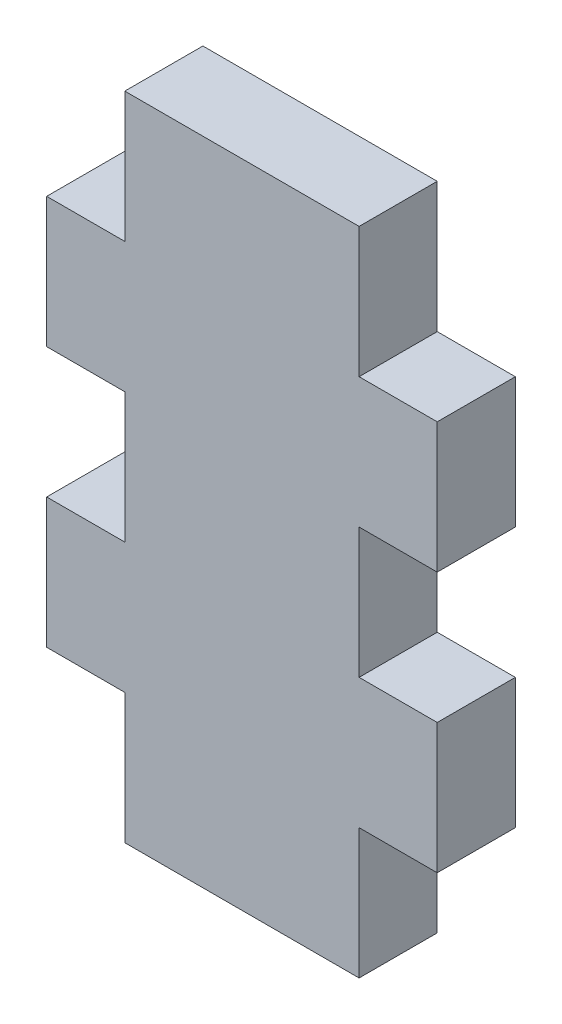
ISO-10303-21;
HEADER;
FILE_DESCRIPTION(('STEP AP214'),'2;1');
FILE_NAME('part.step','',(''),(''),'','','');
FILE_SCHEMA(('AUTOMOTIVE_DESIGN { 1 0 10303 214 1 1 1 1 }'));
ENDSEC;
DATA;
#1=APPLICATION_CONTEXT('core data for automotive mechanical design processes');
#2=APPLICATION_PROTOCOL_DEFINITION('international standard','automotive_design',2000,#1);
#3=PRODUCT_CONTEXT('',#1,'mechanical');
#4=PRODUCT('Part','Part','',(#3));
#5=PRODUCT_RELATED_PRODUCT_CATEGORY('part','',(#4));
#6=PRODUCT_DEFINITION_FORMATION('','',#4);
#7=PRODUCT_DEFINITION_CONTEXT('part definition',#1,'design');
#8=PRODUCT_DEFINITION('design','',#6,#7);
#9=PRODUCT_DEFINITION_SHAPE('','',#8);
#10=(LENGTH_UNIT() NAMED_UNIT(*) SI_UNIT(.MILLI.,.METRE.));
#11=(NAMED_UNIT(*) PLANE_ANGLE_UNIT() SI_UNIT($,.RADIAN.));
#12=(NAMED_UNIT(*) SI_UNIT($,.STERADIAN.) SOLID_ANGLE_UNIT());
#13=UNCERTAINTY_MEASURE_WITH_UNIT(LENGTH_MEASURE(1.E-05),#10,'distance_accuracy_value','');
#14=(GEOMETRIC_REPRESENTATION_CONTEXT(3) GLOBAL_UNCERTAINTY_ASSIGNED_CONTEXT((#13)) GLOBAL_UNIT_ASSIGNED_CONTEXT((#10,
#11,#12)) REPRESENTATION_CONTEXT('',''));
#15=CARTESIAN_POINT('',(0.,0.,0.));
#16=DIRECTION('',(0.,0.,1.));
#17=DIRECTION('',(1.,0.,0.));
#18=AXIS2_PLACEMENT_3D('',#15,#16,#17);
#19=CARTESIAN_POINT('',(0.,0.,15.24));
#20=DIRECTION('',(-1.,0.,0.));
#21=DIRECTION('',(0.,-1.,0.));
#22=AXIS2_PLACEMENT_3D('',#19,#20,#21);
#23=PLANE('',#22);
#24=DIRECTION('',(0.,0.,1.));
#25=VECTOR('',#24,1.);
#26=CARTESIAN_POINT('',(0.,76.2,0.));
#27=LINE('',#26,#25);
#28=CARTESIAN_POINT('',(0.,76.2,0.));
#29=VERTEX_POINT('',#28);
#30=CARTESIAN_POINT('',(0.,76.2,15.24));
#31=VERTEX_POINT('',#30);
#32=EDGE_CURVE('E233',#29,#31,#27,.T.);
#33=ORIENTED_EDGE('',*,*,#32,.T.);
#34=DIRECTION('',(0.,1.,0.));
#35=VECTOR('',#34,1.);
#36=CARTESIAN_POINT('',(0.,0.,15.24));
#37=LINE('',#36,#35);
#38=CARTESIAN_POINT('',(0.,101.6,15.24));
#39=VERTEX_POINT('',#38);
#40=EDGE_CURVE('E42',#31,#39,#37,.T.);
#41=ORIENTED_EDGE('',*,*,#40,.T.);
#42=DIRECTION('',(0.,0.,1.));
#43=VECTOR('',#42,1.);
#44=CARTESIAN_POINT('',(0.,101.6,0.));
#45=LINE('',#44,#43);
#46=CARTESIAN_POINT('',(0.,101.6,0.));
#47=VERTEX_POINT('',#46);
#48=EDGE_CURVE('E220',#47,#39,#45,.T.);
#49=ORIENTED_EDGE('',*,*,#48,.F.);
#50=DIRECTION('',(0.,1.,0.));
#51=VECTOR('',#50,1.);
#52=CARTESIAN_POINT('',(0.,0.,0.));
#53=LINE('',#52,#51);
#54=EDGE_CURVE('E37',#29,#47,#53,.T.);
#55=ORIENTED_EDGE('',*,*,#54,.F.);
#56=EDGE_LOOP('',(#33,#41,#49,#55));
#57=FACE_BOUND('',#56,.T.);
#58=ADVANCED_FACE('F33',(#57),#23,.T.);
#59=CARTESIAN_POINT('',(76.2,0.,15.24));
#60=DIRECTION('',(-1.,0.,0.));
#61=DIRECTION('',(0.,-1.,0.));
#62=AXIS2_PLACEMENT_3D('',#59,#60,#61);
#63=PLANE('',#62);
#64=DIRECTION('',(0.,1.,0.));
#65=VECTOR('',#64,1.);
#66=CARTESIAN_POINT('',(76.2,0.,0.));
#67=LINE('',#66,#65);
#68=CARTESIAN_POINT('',(76.2,25.4,0.));
#69=VERTEX_POINT('',#68);
#70=CARTESIAN_POINT('',(76.2,50.8,0.));
#71=VERTEX_POINT('',#70);
#72=EDGE_CURVE('E190',#69,#71,#67,.T.);
#73=ORIENTED_EDGE('',*,*,#72,.T.);
#74=DIRECTION('',(0.,0.,1.));
#75=VECTOR('',#74,1.);
#76=CARTESIAN_POINT('',(76.2,50.8,0.));
#77=LINE('',#76,#75);
#78=CARTESIAN_POINT('',(76.2,50.8,15.24));
#79=VERTEX_POINT('',#78);
#80=EDGE_CURVE('E244',#71,#79,#77,.T.);
#81=ORIENTED_EDGE('',*,*,#80,.T.);
#82=DIRECTION('',(0.,1.,0.));
#83=VECTOR('',#82,1.);
#84=CARTESIAN_POINT('',(76.2,0.,15.24));
#85=LINE('',#84,#83);
#86=CARTESIAN_POINT('',(76.2,25.4,15.24));
#87=VERTEX_POINT('',#86);
#88=EDGE_CURVE('E192',#87,#79,#85,.T.);
#89=ORIENTED_EDGE('',*,*,#88,.F.);
#90=DIRECTION('',(0.,0.,1.));
#91=VECTOR('',#90,1.);
#92=CARTESIAN_POINT('',(76.2,25.4,0.));
#93=LINE('',#92,#91);
#94=EDGE_CURVE('E176',#69,#87,#93,.T.);
#95=ORIENTED_EDGE('',*,*,#94,.F.);
#96=EDGE_LOOP('',(#73,#81,#89,#95));
#97=FACE_BOUND('',#96,.T.);
#98=ADVANCED_FACE('F188',(#97),#63,.F.);
#99=CARTESIAN_POINT('',(0.,127.,15.24));
#100=DIRECTION('',(0.,1.,0.));
#101=DIRECTION('',(0.,0.,1.));
#102=AXIS2_PLACEMENT_3D('',#99,#100,#101);
#103=PLANE('',#102);
#104=DIRECTION('',(0.,0.,1.));
#105=VECTOR('',#104,1.);
#106=CARTESIAN_POINT('',(60.96,127.,0.));
#107=LINE('',#106,#105);
#108=CARTESIAN_POINT('',(60.96,127.,0.));
#109=VERTEX_POINT('',#108);
#110=CARTESIAN_POINT('',(60.96,127.,15.24));
#111=VERTEX_POINT('',#110);
#112=EDGE_CURVE('E262',#109,#111,#107,.T.);
#113=ORIENTED_EDGE('',*,*,#112,.F.);
#114=DIRECTION('',(1.,0.,0.));
#115=VECTOR('',#114,1.);
#116=CARTESIAN_POINT('',(0.,127.,0.));
#117=LINE('',#116,#115);
#118=CARTESIAN_POINT('',(15.24,127.,0.));
#119=VERTEX_POINT('',#118);
#120=EDGE_CURVE('E204',#119,#109,#117,.T.);
#121=ORIENTED_EDGE('',*,*,#120,.F.);
#122=DIRECTION('',(0.,0.,1.));
#123=VECTOR('',#122,1.);
#124=CARTESIAN_POINT('',(15.24,127.,0.));
#125=LINE('',#124,#123);
#126=CARTESIAN_POINT('',(15.24,127.,15.24));
#127=VERTEX_POINT('',#126);
#128=EDGE_CURVE('E207',#119,#127,#125,.T.);
#129=ORIENTED_EDGE('',*,*,#128,.T.);
#130=DIRECTION('',(1.,0.,0.));
#131=VECTOR('',#130,1.);
#132=CARTESIAN_POINT('',(0.,127.,15.24));
#133=LINE('',#132,#131);
#134=EDGE_CURVE('E216',#127,#111,#133,.T.);
#135=ORIENTED_EDGE('',*,*,#134,.T.);
#136=EDGE_LOOP('',(#113,#121,#129,#135));
#137=FACE_BOUND('',#136,.T.);
#138=ADVANCED_FACE('F35',(#137),#103,.T.);
#139=DIRECTION('',(0.,0.,1.));
#140=VECTOR('',#139,1.);
#141=CARTESIAN_POINT('',(0.,50.8,0.));
#142=LINE('',#141,#140);
#143=CARTESIAN_POINT('',(0.,50.8,0.));
#144=VERTEX_POINT('',#143);
#145=CARTESIAN_POINT('',(0.,50.8,15.24));
#146=VERTEX_POINT('',#145);
#147=EDGE_CURVE('E296',#144,#146,#142,.T.);
#148=ORIENTED_EDGE('',*,*,#147,.F.);
#149=CARTESIAN_POINT('',(0.,25.4,0.));
#150=VERTEX_POINT('',#149);
#151=EDGE_CURVE('E219',#150,#144,#53,.T.);
#152=ORIENTED_EDGE('',*,*,#151,.F.);
#153=DIRECTION('',(0.,0.,1.));
#154=VECTOR('',#153,1.);
#155=CARTESIAN_POINT('',(0.,25.4,0.));
#156=LINE('',#155,#154);
#157=CARTESIAN_POINT('',(0.,25.4,15.24));
#158=VERTEX_POINT('',#157);
#159=EDGE_CURVE('E284',#150,#158,#156,.T.);
#160=ORIENTED_EDGE('',*,*,#159,.T.);
#161=EDGE_CURVE('E11',#158,#146,#37,.T.);
#162=ORIENTED_EDGE('',*,*,#161,.T.);
#163=EDGE_LOOP('',(#148,#152,#160,#162));
#164=FACE_BOUND('',#163,.T.);
#165=ADVANCED_FACE('F344',(#164),#23,.T.);
#166=CARTESIAN_POINT('',(0.,0.,15.24));
#167=DIRECTION('',(0.,1.,0.));
#168=DIRECTION('',(0.,0.,1.));
#169=AXIS2_PLACEMENT_3D('',#166,#167,#168);
#170=PLANE('',#169);
#171=DIRECTION('',(1.,0.,0.));
#172=VECTOR('',#171,1.);
#173=CARTESIAN_POINT('',(0.,0.,15.24));
#174=LINE('',#173,#172);
#175=CARTESIAN_POINT('',(15.24,0.,15.24));
#176=VERTEX_POINT('',#175);
#177=CARTESIAN_POINT('',(60.96,0.,15.24));
#178=VERTEX_POINT('',#177);
#179=EDGE_CURVE('E210',#176,#178,#174,.T.);
#180=ORIENTED_EDGE('',*,*,#179,.F.);
#181=DIRECTION('',(0.,0.,1.));
#182=VECTOR('',#181,1.);
#183=CARTESIAN_POINT('',(15.24,0.,0.));
#184=LINE('',#183,#182);
#185=CARTESIAN_POINT('',(15.24,0.,0.));
#186=VERTEX_POINT('',#185);
#187=EDGE_CURVE('E280',#186,#176,#184,.T.);
#188=ORIENTED_EDGE('',*,*,#187,.F.);
#189=DIRECTION('',(1.,0.,0.));
#190=VECTOR('',#189,1.);
#191=CARTESIAN_POINT('',(0.,0.,0.));
#192=LINE('',#191,#190);
#193=CARTESIAN_POINT('',(60.96,0.,0.));
#194=VERTEX_POINT('',#193);
#195=EDGE_CURVE('E199',#186,#194,#192,.T.);
#196=ORIENTED_EDGE('',*,*,#195,.T.);
#197=DIRECTION('',(0.,0.,1.));
#198=VECTOR('',#197,1.);
#199=CARTESIAN_POINT('',(60.96,0.,0.));
#200=LINE('',#199,#198);
#201=EDGE_CURVE('E256',#194,#178,#200,.T.);
#202=ORIENTED_EDGE('',*,*,#201,.T.);
#203=EDGE_LOOP('',(#180,#188,#196,#202));
#204=FACE_BOUND('',#203,.T.);
#205=ADVANCED_FACE('F329',(#204),#170,.F.);
#206=CARTESIAN_POINT('',(76.2,76.2,0.));
#207=VERTEX_POINT('',#206);
#208=CARTESIAN_POINT('',(76.2,101.6,0.));
#209=VERTEX_POINT('',#208);
#210=EDGE_CURVE('E200',#207,#209,#67,.T.);
#211=ORIENTED_EDGE('',*,*,#210,.T.);
#212=DIRECTION('',(0.,0.,1.));
#213=VECTOR('',#212,1.);
#214=CARTESIAN_POINT('',(76.2,101.6,0.));
#215=LINE('',#214,#213);
#216=CARTESIAN_POINT('',(76.2,101.6,15.24));
#217=VERTEX_POINT('',#216);
#218=EDGE_CURVE('E267',#209,#217,#215,.T.);
#219=ORIENTED_EDGE('',*,*,#218,.T.);
#220=CARTESIAN_POINT('',(76.2,76.2,15.24));
#221=VERTEX_POINT('',#220);
#222=EDGE_CURVE('E213',#221,#217,#85,.T.);
#223=ORIENTED_EDGE('',*,*,#222,.F.);
#224=DIRECTION('',(0.,0.,1.));
#225=VECTOR('',#224,1.);
#226=CARTESIAN_POINT('',(76.2,76.2,0.));
#227=LINE('',#226,#225);
#228=EDGE_CURVE('E238',#207,#221,#227,.T.);
#229=ORIENTED_EDGE('',*,*,#228,.F.);
#230=EDGE_LOOP('',(#211,#219,#223,#229));
#231=FACE_BOUND('',#230,.T.);
#232=ADVANCED_FACE('F373',(#231),#63,.F.);
#233=CARTESIAN_POINT('',(0.,0.,15.24));
#234=DIRECTION('',(0.,0.,1.));
#235=DIRECTION('',(1.,0.,0.));
#236=AXIS2_PLACEMENT_3D('',#233,#234,#235);
#237=PLANE('',#236);
#238=DIRECTION('',(-1.,0.,0.));
#239=VECTOR('',#238,1.);
#240=CARTESIAN_POINT('',(0.,76.2,15.24));
#241=LINE('',#240,#239);
#242=CARTESIAN_POINT('',(15.24,76.2,15.24));
#243=VERTEX_POINT('',#242);
#244=EDGE_CURVE('E305',#243,#31,#241,.T.);
#245=ORIENTED_EDGE('',*,*,#244,.F.);
#246=DIRECTION('',(0.,1.,0.));
#247=VECTOR('',#246,1.);
#248=CARTESIAN_POINT('',(15.24,76.2,15.24));
#249=LINE('',#248,#247);
#250=CARTESIAN_POINT('',(15.24,50.8,15.24));
#251=VERTEX_POINT('',#250);
#252=EDGE_CURVE('E308',#251,#243,#249,.T.);
#253=ORIENTED_EDGE('',*,*,#252,.F.);
#254=DIRECTION('',(1.,0.,0.));
#255=VECTOR('',#254,1.);
#256=CARTESIAN_POINT('',(0.,50.8,15.24));
#257=LINE('',#256,#255);
#258=EDGE_CURVE('E287',#146,#251,#257,.T.);
#259=ORIENTED_EDGE('',*,*,#258,.F.);
#260=ORIENTED_EDGE('',*,*,#161,.F.);
#261=DIRECTION('',(-1.,0.,0.));
#262=VECTOR('',#261,1.);
#263=CARTESIAN_POINT('',(0.,25.4,15.24));
#264=LINE('',#263,#262);
#265=CARTESIAN_POINT('',(15.24,25.4,15.24));
#266=VERTEX_POINT('',#265);
#267=EDGE_CURVE('E288',#266,#158,#264,.T.);
#268=ORIENTED_EDGE('',*,*,#267,.F.);
#269=DIRECTION('',(0.,1.,0.));
#270=VECTOR('',#269,1.);
#271=CARTESIAN_POINT('',(15.24,0.,15.24));
#272=LINE('',#271,#270);
#273=EDGE_CURVE('E270',#176,#266,#272,.T.);
#274=ORIENTED_EDGE('',*,*,#273,.F.);
#275=ORIENTED_EDGE('',*,*,#179,.T.);
#276=DIRECTION('',(0.,-1.,0.));
#277=VECTOR('',#276,1.);
#278=CARTESIAN_POINT('',(60.96,25.4,15.24));
#279=LINE('',#278,#277);
#280=CARTESIAN_POINT('',(60.96,25.4,15.24));
#281=VERTEX_POINT('',#280);
#282=EDGE_CURVE('E183',#281,#178,#279,.T.);
#283=ORIENTED_EDGE('',*,*,#282,.F.);
#284=DIRECTION('',(-1.,0.,0.));
#285=VECTOR('',#284,1.);
#286=CARTESIAN_POINT('',(76.2,25.4,15.24));
#287=LINE('',#286,#285);
#288=EDGE_CURVE('E322',#87,#281,#287,.T.);
#289=ORIENTED_EDGE('',*,*,#288,.F.);
#290=ORIENTED_EDGE('',*,*,#88,.T.);
#291=DIRECTION('',(1.,0.,0.));
#292=VECTOR('',#291,1.);
#293=CARTESIAN_POINT('',(76.2,50.8,15.24));
#294=LINE('',#293,#292);
#295=CARTESIAN_POINT('',(60.96,50.8,15.24));
#296=VERTEX_POINT('',#295);
#297=EDGE_CURVE('E247',#296,#79,#294,.T.);
#298=ORIENTED_EDGE('',*,*,#297,.F.);
#299=DIRECTION('',(0.,-1.,0.));
#300=VECTOR('',#299,1.);
#301=CARTESIAN_POINT('',(60.96,76.2,15.24));
#302=LINE('',#301,#300);
#303=CARTESIAN_POINT('',(60.96,76.2,15.24));
#304=VERTEX_POINT('',#303);
#305=EDGE_CURVE('E250',#304,#296,#302,.T.);
#306=ORIENTED_EDGE('',*,*,#305,.F.);
#307=DIRECTION('',(-1.,0.,0.));
#308=VECTOR('',#307,1.);
#309=CARTESIAN_POINT('',(76.2,76.2,15.24));
#310=LINE('',#309,#308);
#311=EDGE_CURVE('E253',#221,#304,#310,.T.);
#312=ORIENTED_EDGE('',*,*,#311,.F.);
#313=ORIENTED_EDGE('',*,*,#222,.T.);
#314=DIRECTION('',(1.,0.,0.));
#315=VECTOR('',#314,1.);
#316=CARTESIAN_POINT('',(76.2,101.6,15.24));
#317=LINE('',#316,#315);
#318=CARTESIAN_POINT('',(60.96,101.6,15.24));
#319=VERTEX_POINT('',#318);
#320=EDGE_CURVE('E271',#319,#217,#317,.T.);
#321=ORIENTED_EDGE('',*,*,#320,.F.);
#322=DIRECTION('',(0.,-1.,0.));
#323=VECTOR('',#322,1.);
#324=CARTESIAN_POINT('',(60.96,127.,15.24));
#325=LINE('',#324,#323);
#326=EDGE_CURVE('E246',#111,#319,#325,.T.);
#327=ORIENTED_EDGE('',*,*,#326,.F.);
#328=ORIENTED_EDGE('',*,*,#134,.F.);
#329=DIRECTION('',(0.,1.,0.));
#330=VECTOR('',#329,1.);
#331=CARTESIAN_POINT('',(15.24,127.,15.24));
#332=LINE('',#331,#330);
#333=CARTESIAN_POINT('',(15.24,101.6,15.24));
#334=VERTEX_POINT('',#333);
#335=EDGE_CURVE('E227',#334,#127,#332,.T.);
#336=ORIENTED_EDGE('',*,*,#335,.F.);
#337=DIRECTION('',(1.,0.,0.));
#338=VECTOR('',#337,1.);
#339=CARTESIAN_POINT('',(0.,101.6,15.24));
#340=LINE('',#339,#338);
#341=EDGE_CURVE('E230',#39,#334,#340,.T.);
#342=ORIENTED_EDGE('',*,*,#341,.F.);
#343=ORIENTED_EDGE('',*,*,#40,.F.);
#344=EDGE_LOOP('',(#245,#253,#259,#260,#268,#274,#275,#283,#289,#290,#298,#306,#312,#313,#321,
#327,#328,#336,#342,#343));
#345=FACE_BOUND('',#344,.T.);
#346=ADVANCED_FACE('F336',(#345),#237,.T.);
#347=CARTESIAN_POINT('',(0.,0.,0.));
#348=DIRECTION('',(0.,0.,1.));
#349=DIRECTION('',(1.,0.,0.));
#350=AXIS2_PLACEMENT_3D('',#347,#348,#349);
#351=PLANE('',#350);
#352=DIRECTION('',(0.,1.,0.));
#353=VECTOR('',#352,1.);
#354=CARTESIAN_POINT('',(15.24,76.2,0.));
#355=LINE('',#354,#353);
#356=CARTESIAN_POINT('',(15.24,50.8,0.));
#357=VERTEX_POINT('',#356);
#358=CARTESIAN_POINT('',(15.24,76.2,0.));
#359=VERTEX_POINT('',#358);
#360=EDGE_CURVE('E50',#357,#359,#355,.T.);
#361=ORIENTED_EDGE('',*,*,#360,.T.);
#362=DIRECTION('',(-1.,0.,0.));
#363=VECTOR('',#362,1.);
#364=CARTESIAN_POINT('',(0.,76.2,0.));
#365=LINE('',#364,#363);
#366=EDGE_CURVE('E299',#359,#29,#365,.T.);
#367=ORIENTED_EDGE('',*,*,#366,.T.);
#368=ORIENTED_EDGE('',*,*,#54,.T.);
#369=DIRECTION('',(1.,0.,0.));
#370=VECTOR('',#369,1.);
#371=CARTESIAN_POINT('',(0.,101.6,0.));
#372=LINE('',#371,#370);
#373=CARTESIAN_POINT('',(15.24,101.6,0.));
#374=VERTEX_POINT('',#373);
#375=EDGE_CURVE('E229',#47,#374,#372,.T.);
#376=ORIENTED_EDGE('',*,*,#375,.T.);
#377=DIRECTION('',(0.,1.,0.));
#378=VECTOR('',#377,1.);
#379=CARTESIAN_POINT('',(15.24,127.,0.));
#380=LINE('',#379,#378);
#381=EDGE_CURVE('E223',#374,#119,#380,.T.);
#382=ORIENTED_EDGE('',*,*,#381,.T.);
#383=ORIENTED_EDGE('',*,*,#120,.T.);
#384=DIRECTION('',(0.,-1.,0.));
#385=VECTOR('',#384,1.);
#386=CARTESIAN_POINT('',(60.96,127.,0.));
#387=LINE('',#386,#385);
#388=CARTESIAN_POINT('',(60.96,101.6,0.));
#389=VERTEX_POINT('',#388);
#390=EDGE_CURVE('E273',#109,#389,#387,.T.);
#391=ORIENTED_EDGE('',*,*,#390,.T.);
#392=DIRECTION('',(1.,0.,0.));
#393=VECTOR('',#392,1.);
#394=CARTESIAN_POINT('',(76.2,101.6,0.));
#395=LINE('',#394,#393);
#396=EDGE_CURVE('E265',#389,#209,#395,.T.);
#397=ORIENTED_EDGE('',*,*,#396,.T.);
#398=ORIENTED_EDGE('',*,*,#210,.F.);
#399=DIRECTION('',(-1.,0.,0.));
#400=VECTOR('',#399,1.);
#401=CARTESIAN_POINT('',(76.2,76.2,0.));
#402=LINE('',#401,#400);
#403=CARTESIAN_POINT('',(60.96,76.2,0.));
#404=VERTEX_POINT('',#403);
#405=EDGE_CURVE('E249',#207,#404,#402,.T.);
#406=ORIENTED_EDGE('',*,*,#405,.T.);
#407=DIRECTION('',(0.,-1.,0.));
#408=VECTOR('',#407,1.);
#409=CARTESIAN_POINT('',(60.96,76.2,0.));
#410=LINE('',#409,#408);
#411=CARTESIAN_POINT('',(60.96,50.8,0.));
#412=VERTEX_POINT('',#411);
#413=EDGE_CURVE('E258',#404,#412,#410,.T.);
#414=ORIENTED_EDGE('',*,*,#413,.T.);
#415=DIRECTION('',(1.,0.,0.));
#416=VECTOR('',#415,1.);
#417=CARTESIAN_POINT('',(76.2,50.8,0.));
#418=LINE('',#417,#416);
#419=EDGE_CURVE('E198',#412,#71,#418,.T.);
#420=ORIENTED_EDGE('',*,*,#419,.T.);
#421=ORIENTED_EDGE('',*,*,#72,.F.);
#422=DIRECTION('',(-1.,0.,0.));
#423=VECTOR('',#422,1.);
#424=CARTESIAN_POINT('',(76.2,25.4,0.));
#425=LINE('',#424,#423);
#426=CARTESIAN_POINT('',(60.96,25.4,0.));
#427=VERTEX_POINT('',#426);
#428=EDGE_CURVE('E172',#69,#427,#425,.T.);
#429=ORIENTED_EDGE('',*,*,#428,.T.);
#430=DIRECTION('',(0.,-1.,0.));
#431=VECTOR('',#430,1.);
#432=CARTESIAN_POINT('',(60.96,25.4,0.));
#433=LINE('',#432,#431);
#434=EDGE_CURVE('E182',#427,#194,#433,.T.);
#435=ORIENTED_EDGE('',*,*,#434,.T.);
#436=ORIENTED_EDGE('',*,*,#195,.F.);
#437=DIRECTION('',(0.,1.,0.));
#438=VECTOR('',#437,1.);
#439=CARTESIAN_POINT('',(15.24,0.,0.));
#440=LINE('',#439,#438);
#441=CARTESIAN_POINT('',(15.24,25.4,0.));
#442=VERTEX_POINT('',#441);
#443=EDGE_CURVE('E290',#186,#442,#440,.T.);
#444=ORIENTED_EDGE('',*,*,#443,.T.);
#445=DIRECTION('',(-1.,0.,0.));
#446=VECTOR('',#445,1.);
#447=CARTESIAN_POINT('',(0.,25.4,0.));
#448=LINE('',#447,#446);
#449=EDGE_CURVE('E58',#442,#150,#448,.T.);
#450=ORIENTED_EDGE('',*,*,#449,.T.);
#451=ORIENTED_EDGE('',*,*,#151,.T.);
#452=DIRECTION('',(1.,0.,0.));
#453=VECTOR('',#452,1.);
#454=CARTESIAN_POINT('',(0.,50.8,0.));
#455=LINE('',#454,#453);
#456=EDGE_CURVE('E307',#144,#357,#455,.T.);
#457=ORIENTED_EDGE('',*,*,#456,.T.);
#458=EDGE_LOOP('',(#361,#367,#368,#376,#382,#383,#391,#397,#398,#406,#414,#420,#421,#429,#435,
#436,#444,#450,#451,#457));
#459=FACE_BOUND('',#458,.T.);
#460=ADVANCED_FACE('F195',(#459),#351,.F.);
#461=CARTESIAN_POINT('',(15.24,127.,0.));
#462=DIRECTION('',(1.,0.,0.));
#463=DIRECTION('',(0.,1.,0.));
#464=AXIS2_PLACEMENT_3D('',#461,#462,#463);
#465=PLANE('',#464);
#466=ORIENTED_EDGE('',*,*,#335,.T.);
#467=ORIENTED_EDGE('',*,*,#128,.F.);
#468=ORIENTED_EDGE('',*,*,#381,.F.);
#469=DIRECTION('',(0.,0.,1.));
#470=VECTOR('',#469,1.);
#471=CARTESIAN_POINT('',(15.24,101.6,0.));
#472=LINE('',#471,#470);
#473=EDGE_CURVE('E222',#374,#334,#472,.T.);
#474=ORIENTED_EDGE('',*,*,#473,.T.);
#475=EDGE_LOOP('',(#466,#467,#468,#474));
#476=FACE_BOUND('',#475,.T.);
#477=ADVANCED_FACE('F360',(#476),#465,.F.);
#478=CARTESIAN_POINT('',(0.,101.6,0.));
#479=DIRECTION('',(0.,-1.,0.));
#480=DIRECTION('',(0.,0.,-1.));
#481=AXIS2_PLACEMENT_3D('',#478,#479,#480);
#482=PLANE('',#481);
#483=ORIENTED_EDGE('',*,*,#341,.T.);
#484=ORIENTED_EDGE('',*,*,#473,.F.);
#485=ORIENTED_EDGE('',*,*,#375,.F.);
#486=ORIENTED_EDGE('',*,*,#48,.T.);
#487=EDGE_LOOP('',(#483,#484,#485,#486));
#488=FACE_BOUND('',#487,.T.);
#489=ADVANCED_FACE('F354',(#488),#482,.F.);
#490=CARTESIAN_POINT('',(60.96,25.4,0.));
#491=DIRECTION('',(-1.,0.,0.));
#492=DIRECTION('',(0.,0.,1.));
#493=AXIS2_PLACEMENT_3D('',#490,#491,#492);
#494=PLANE('',#493);
#495=ORIENTED_EDGE('',*,*,#282,.T.);
#496=ORIENTED_EDGE('',*,*,#201,.F.);
#497=ORIENTED_EDGE('',*,*,#434,.F.);
#498=DIRECTION('',(0.,0.,1.));
#499=VECTOR('',#498,1.);
#500=CARTESIAN_POINT('',(60.96,25.4,0.));
#501=LINE('',#500,#499);
#502=EDGE_CURVE('E178',#427,#281,#501,.T.);
#503=ORIENTED_EDGE('',*,*,#502,.T.);
#504=EDGE_LOOP('',(#495,#496,#497,#503));
#505=FACE_BOUND('',#504,.T.);
#506=ADVANCED_FACE('F385',(#505),#494,.F.);
#507=CARTESIAN_POINT('',(76.2,25.4,0.));
#508=DIRECTION('',(0.,1.,0.));
#509=DIRECTION('',(-1.,0.,0.));
#510=AXIS2_PLACEMENT_3D('',#507,#508,#509);
#511=PLANE('',#510);
#512=ORIENTED_EDGE('',*,*,#288,.T.);
#513=ORIENTED_EDGE('',*,*,#502,.F.);
#514=ORIENTED_EDGE('',*,*,#428,.F.);
#515=ORIENTED_EDGE('',*,*,#94,.T.);
#516=EDGE_LOOP('',(#512,#513,#514,#515));
#517=FACE_BOUND('',#516,.T.);
#518=ADVANCED_FACE('F175',(#517),#511,.F.);
#519=CARTESIAN_POINT('',(76.2,50.8,0.));
#520=DIRECTION('',(0.,-1.,0.));
#521=DIRECTION('',(0.,0.,-1.));
#522=AXIS2_PLACEMENT_3D('',#519,#520,#521);
#523=PLANE('',#522);
#524=ORIENTED_EDGE('',*,*,#297,.T.);
#525=ORIENTED_EDGE('',*,*,#80,.F.);
#526=ORIENTED_EDGE('',*,*,#419,.F.);
#527=DIRECTION('',(0.,0.,1.));
#528=VECTOR('',#527,1.);
#529=CARTESIAN_POINT('',(60.96,50.8,0.));
#530=LINE('',#529,#528);
#531=EDGE_CURVE('E242',#412,#296,#530,.T.);
#532=ORIENTED_EDGE('',*,*,#531,.T.);
#533=EDGE_LOOP('',(#524,#525,#526,#532));
#534=FACE_BOUND('',#533,.T.);
#535=ADVANCED_FACE('F384',(#534),#523,.F.);
#536=CARTESIAN_POINT('',(60.96,76.2,0.));
#537=DIRECTION('',(-1.,0.,0.));
#538=DIRECTION('',(0.,-1.,0.));
#539=AXIS2_PLACEMENT_3D('',#536,#537,#538);
#540=PLANE('',#539);
#541=ORIENTED_EDGE('',*,*,#305,.T.);
#542=ORIENTED_EDGE('',*,*,#531,.F.);
#543=ORIENTED_EDGE('',*,*,#413,.F.);
#544=DIRECTION('',(0.,0.,1.));
#545=VECTOR('',#544,1.);
#546=CARTESIAN_POINT('',(60.96,76.2,0.));
#547=LINE('',#546,#545);
#548=EDGE_CURVE('E240',#404,#304,#547,.T.);
#549=ORIENTED_EDGE('',*,*,#548,.T.);
#550=EDGE_LOOP('',(#541,#542,#543,#549));
#551=FACE_BOUND('',#550,.T.);
#552=ADVANCED_FACE('F382',(#551),#540,.F.);
#553=CARTESIAN_POINT('',(76.2,76.2,0.));
#554=DIRECTION('',(0.,1.,0.));
#555=DIRECTION('',(0.,0.,1.));
#556=AXIS2_PLACEMENT_3D('',#553,#554,#555);
#557=PLANE('',#556);
#558=ORIENTED_EDGE('',*,*,#311,.T.);
#559=ORIENTED_EDGE('',*,*,#548,.F.);
#560=ORIENTED_EDGE('',*,*,#405,.F.);
#561=ORIENTED_EDGE('',*,*,#228,.T.);
#562=EDGE_LOOP('',(#558,#559,#560,#561));
#563=FACE_BOUND('',#562,.T.);
#564=ADVANCED_FACE('F380',(#563),#557,.F.);
#565=CARTESIAN_POINT('',(76.2,101.6,0.));
#566=DIRECTION('',(0.,-1.,0.));
#567=DIRECTION('',(0.,0.,-1.));
#568=AXIS2_PLACEMENT_3D('',#565,#566,#567);
#569=PLANE('',#568);
#570=ORIENTED_EDGE('',*,*,#320,.T.);
#571=ORIENTED_EDGE('',*,*,#218,.F.);
#572=ORIENTED_EDGE('',*,*,#396,.F.);
#573=DIRECTION('',(0.,0.,1.));
#574=VECTOR('',#573,1.);
#575=CARTESIAN_POINT('',(60.96,101.6,0.));
#576=LINE('',#575,#574);
#577=EDGE_CURVE('E264',#389,#319,#576,.T.);
#578=ORIENTED_EDGE('',*,*,#577,.T.);
#579=EDGE_LOOP('',(#570,#571,#572,#578));
#580=FACE_BOUND('',#579,.T.);
#581=ADVANCED_FACE('F370',(#580),#569,.F.);
#582=CARTESIAN_POINT('',(60.96,127.,0.));
#583=DIRECTION('',(-1.,0.,0.));
#584=DIRECTION('',(0.,0.,1.));
#585=AXIS2_PLACEMENT_3D('',#582,#583,#584);
#586=PLANE('',#585);
#587=ORIENTED_EDGE('',*,*,#326,.T.);
#588=ORIENTED_EDGE('',*,*,#577,.F.);
#589=ORIENTED_EDGE('',*,*,#390,.F.);
#590=ORIENTED_EDGE('',*,*,#112,.T.);
#591=EDGE_LOOP('',(#587,#588,#589,#590));
#592=FACE_BOUND('',#591,.T.);
#593=ADVANCED_FACE('F367',(#592),#586,.F.);
#594=CARTESIAN_POINT('',(0.,25.4,0.));
#595=DIRECTION('',(0.,1.,0.));
#596=DIRECTION('',(0.,0.,1.));
#597=AXIS2_PLACEMENT_3D('',#594,#595,#596);
#598=PLANE('',#597);
#599=ORIENTED_EDGE('',*,*,#267,.T.);
#600=ORIENTED_EDGE('',*,*,#159,.F.);
#601=ORIENTED_EDGE('',*,*,#449,.F.);
#602=DIRECTION('',(0.,0.,1.));
#603=VECTOR('',#602,1.);
#604=CARTESIAN_POINT('',(15.24,25.4,0.));
#605=LINE('',#604,#603);
#606=EDGE_CURVE('E282',#442,#266,#605,.T.);
#607=ORIENTED_EDGE('',*,*,#606,.T.);
#608=EDGE_LOOP('',(#599,#600,#601,#607));
#609=FACE_BOUND('',#608,.T.);
#610=ADVANCED_FACE('F340',(#609),#598,.F.);
#611=CARTESIAN_POINT('',(15.24,0.,0.));
#612=DIRECTION('',(1.,0.,0.));
#613=DIRECTION('',(0.,1.,0.));
#614=AXIS2_PLACEMENT_3D('',#611,#612,#613);
#615=PLANE('',#614);
#616=ORIENTED_EDGE('',*,*,#273,.T.);
#617=ORIENTED_EDGE('',*,*,#606,.F.);
#618=ORIENTED_EDGE('',*,*,#443,.F.);
#619=ORIENTED_EDGE('',*,*,#187,.T.);
#620=EDGE_LOOP('',(#616,#617,#618,#619));
#621=FACE_BOUND('',#620,.T.);
#622=ADVANCED_FACE('F332',(#621),#615,.F.);
#623=CARTESIAN_POINT('',(0.,76.2,0.));
#624=DIRECTION('',(0.,1.,0.));
#625=DIRECTION('',(-1.,0.,0.));
#626=AXIS2_PLACEMENT_3D('',#623,#624,#625);
#627=PLANE('',#626);
#628=ORIENTED_EDGE('',*,*,#244,.T.);
#629=ORIENTED_EDGE('',*,*,#32,.F.);
#630=ORIENTED_EDGE('',*,*,#366,.F.);
#631=DIRECTION('',(0.,0.,1.));
#632=VECTOR('',#631,1.);
#633=CARTESIAN_POINT('',(15.24,76.2,0.));
#634=LINE('',#633,#632);
#635=EDGE_CURVE('E301',#359,#243,#634,.T.);
#636=ORIENTED_EDGE('',*,*,#635,.T.);
#637=EDGE_LOOP('',(#628,#629,#630,#636));
#638=FACE_BOUND('',#637,.T.);
#639=ADVANCED_FACE('F491',(#638),#627,.F.);
#640=CARTESIAN_POINT('',(15.24,76.2,0.));
#641=DIRECTION('',(1.,0.,0.));
#642=DIRECTION('',(0.,1.,0.));
#643=AXIS2_PLACEMENT_3D('',#640,#641,#642);
#644=PLANE('',#643);
#645=ORIENTED_EDGE('',*,*,#252,.T.);
#646=ORIENTED_EDGE('',*,*,#635,.F.);
#647=ORIENTED_EDGE('',*,*,#360,.F.);
#648=DIRECTION('',(0.,0.,1.));
#649=VECTOR('',#648,1.);
#650=CARTESIAN_POINT('',(15.24,50.8,0.));
#651=LINE('',#650,#649);
#652=EDGE_CURVE('E298',#357,#251,#651,.T.);
#653=ORIENTED_EDGE('',*,*,#652,.T.);
#654=EDGE_LOOP('',(#645,#646,#647,#653));
#655=FACE_BOUND('',#654,.T.);
#656=ADVANCED_FACE('F499',(#655),#644,.F.);
#657=CARTESIAN_POINT('',(0.,50.8,0.));
#658=DIRECTION('',(0.,-1.,0.));
#659=DIRECTION('',(1.,0.,0.));
#660=AXIS2_PLACEMENT_3D('',#657,#658,#659);
#661=PLANE('',#660);
#662=ORIENTED_EDGE('',*,*,#258,.T.);
#663=ORIENTED_EDGE('',*,*,#652,.F.);
#664=ORIENTED_EDGE('',*,*,#456,.F.);
#665=ORIENTED_EDGE('',*,*,#147,.T.);
#666=EDGE_LOOP('',(#662,#663,#664,#665));
#667=FACE_BOUND('',#666,.T.);
#668=ADVANCED_FACE('F508',(#667),#661,.F.);
#669=CLOSED_SHELL('',(#58,#98,#138,#165,#205,#232,#346,#460,#477,#489,#506,#518,#535,#552,#564,
#581,#593,#610,#622,#639,#656,#668));
#670=MANIFOLD_SOLID_BREP('B2',#669);
#671=ADVANCED_BREP_SHAPE_REPRESENTATION('',(#18,#670),#14);
#672=SHAPE_DEFINITION_REPRESENTATION(#9,#671);
ENDSEC;
END-ISO-10303-21;
